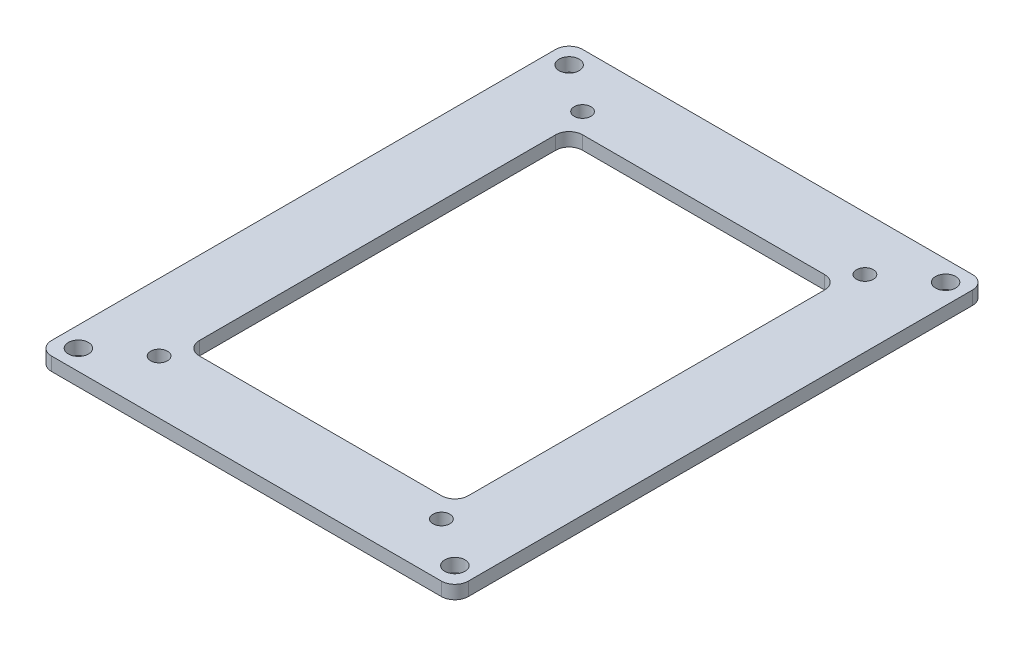
ISO-10303-21;
HEADER;
FILE_DESCRIPTION(('STEP AP214'),'2;1');
FILE_NAME('part.step','',(''),(''),'','','');
FILE_SCHEMA(('AUTOMOTIVE_DESIGN { 1 0 10303 214 1 1 1 1 }'));
ENDSEC;
DATA;
#1=APPLICATION_CONTEXT('core data for automotive mechanical design processes');
#2=APPLICATION_PROTOCOL_DEFINITION('international standard','automotive_design',2000,#1);
#3=PRODUCT_CONTEXT('',#1,'mechanical');
#4=PRODUCT('Part','Part','',(#3));
#5=PRODUCT_RELATED_PRODUCT_CATEGORY('part','',(#4));
#6=PRODUCT_DEFINITION_FORMATION('','',#4);
#7=PRODUCT_DEFINITION_CONTEXT('part definition',#1,'design');
#8=PRODUCT_DEFINITION('design','',#6,#7);
#9=PRODUCT_DEFINITION_SHAPE('','',#8);
#10=(LENGTH_UNIT() NAMED_UNIT(*) SI_UNIT(.MILLI.,.METRE.));
#11=(NAMED_UNIT(*) PLANE_ANGLE_UNIT() SI_UNIT($,.RADIAN.));
#12=(NAMED_UNIT(*) SI_UNIT($,.STERADIAN.) SOLID_ANGLE_UNIT());
#13=UNCERTAINTY_MEASURE_WITH_UNIT(LENGTH_MEASURE(1.E-05),#10,'distance_accuracy_value','');
#14=(GEOMETRIC_REPRESENTATION_CONTEXT(3) GLOBAL_UNCERTAINTY_ASSIGNED_CONTEXT((#13)) GLOBAL_UNIT_ASSIGNED_CONTEXT((#10,
#11,#12)) REPRESENTATION_CONTEXT('',''));
#15=CARTESIAN_POINT('',(0.,0.,0.));
#16=DIRECTION('',(0.,0.,1.));
#17=DIRECTION('',(1.,0.,0.));
#18=AXIS2_PLACEMENT_3D('',#15,#16,#17);
#19=CARTESIAN_POINT('',(0.,2.,0.));
#20=DIRECTION('',(0.,-1.,0.));
#21=DIRECTION('',(0.,0.,-1.));
#22=AXIS2_PLACEMENT_3D('',#19,#20,#21);
#23=PLANE('',#22);
#24=DIRECTION('',(-1.,0.,0.));
#25=VECTOR('',#24,1.);
#26=CARTESIAN_POINT('',(-20.,2.,-28.5));
#27=LINE('',#26,#25);
#28=CARTESIAN_POINT('',(18.,2.,-28.5));
#29=VERTEX_POINT('',#28);
#30=CARTESIAN_POINT('',(-18.,2.,-28.5));
#31=VERTEX_POINT('',#30);
#32=EDGE_CURVE('E257',#29,#31,#27,.T.);
#33=ORIENTED_EDGE('',*,*,#32,.F.);
#34=CARTESIAN_POINT('',(18.,2.,-26.5));
#35=DIRECTION('',(0.,-1.,0.));
#36=DIRECTION('',(0.,0.,-1.));
#37=AXIS2_PLACEMENT_3D('',#34,#35,#36);
#38=CIRCLE('',#37,2.);
#39=CARTESIAN_POINT('',(20.,2.,-26.5));
#40=VERTEX_POINT('',#39);
#41=EDGE_CURVE('E233',#29,#40,#38,.T.);
#42=ORIENTED_EDGE('',*,*,#41,.T.);
#43=DIRECTION('',(0.,0.,-1.));
#44=VECTOR('',#43,1.);
#45=CARTESIAN_POINT('',(20.,2.,28.5));
#46=LINE('',#45,#44);
#47=CARTESIAN_POINT('',(20.,2.,26.5));
#48=VERTEX_POINT('',#47);
#49=EDGE_CURVE('E279',#48,#40,#46,.T.);
#50=ORIENTED_EDGE('',*,*,#49,.F.);
#51=CARTESIAN_POINT('',(18.,2.,26.5));
#52=DIRECTION('',(0.,-1.,0.));
#53=DIRECTION('',(0.,0.,-1.));
#54=AXIS2_PLACEMENT_3D('',#51,#52,#53);
#55=CIRCLE('',#54,2.);
#56=CARTESIAN_POINT('',(18.,2.,28.5));
#57=VERTEX_POINT('',#56);
#58=EDGE_CURVE('E237',#48,#57,#55,.T.);
#59=ORIENTED_EDGE('',*,*,#58,.T.);
#60=DIRECTION('',(1.,0.,0.));
#61=VECTOR('',#60,1.);
#62=CARTESIAN_POINT('',(-20.,2.,28.5));
#63=LINE('',#62,#61);
#64=CARTESIAN_POINT('',(-18.,2.,28.5));
#65=VERTEX_POINT('',#64);
#66=EDGE_CURVE('E248',#65,#57,#63,.T.);
#67=ORIENTED_EDGE('',*,*,#66,.F.);
#68=CARTESIAN_POINT('',(-18.,2.,26.5));
#69=DIRECTION('',(0.,-1.,0.));
#70=DIRECTION('',(0.,0.,-1.));
#71=AXIS2_PLACEMENT_3D('',#68,#69,#70);
#72=CIRCLE('',#71,2.);
#73=CARTESIAN_POINT('',(-20.,2.,26.5));
#74=VERTEX_POINT('',#73);
#75=EDGE_CURVE('E43',#65,#74,#72,.T.);
#76=ORIENTED_EDGE('',*,*,#75,.T.);
#77=DIRECTION('',(0.,0.,1.));
#78=VECTOR('',#77,1.);
#79=CARTESIAN_POINT('',(-20.,2.,28.5));
#80=LINE('',#79,#78);
#81=CARTESIAN_POINT('',(-20.,2.,-26.5));
#82=VERTEX_POINT('',#81);
#83=EDGE_CURVE('E246',#82,#74,#80,.T.);
#84=ORIENTED_EDGE('',*,*,#83,.F.);
#85=CARTESIAN_POINT('',(-18.,2.,-26.5));
#86=DIRECTION('',(0.,-1.,0.));
#87=DIRECTION('',(0.,0.,-1.));
#88=AXIS2_PLACEMENT_3D('',#85,#86,#87);
#89=CIRCLE('',#88,2.);
#90=EDGE_CURVE('E229',#82,#31,#89,.T.);
#91=ORIENTED_EDGE('',*,*,#90,.T.);
#92=EDGE_LOOP('',(#33,#42,#50,#59,#67,#76,#84,#91));
#93=FACE_BOUND('',#92,.T.);
#94=CARTESIAN_POINT('',(28.,2.,36.5));
#95=DIRECTION('',(0.,1.,0.));
#96=DIRECTION('',(0.,0.,1.));
#97=AXIS2_PLACEMENT_3D('',#94,#95,#96);
#98=CIRCLE('',#97,1.49858919696237);
#99=CARTESIAN_POINT('',(28.,2.,37.9985891969624));
#100=VERTEX_POINT('',#99);
#101=EDGE_CURVE('E270',#100,#100,#98,.T.);
#102=ORIENTED_EDGE('',*,*,#101,.F.);
#103=EDGE_LOOP('',(#102));
#104=FACE_BOUND('',#103,.T.);
#105=CARTESIAN_POINT('',(-28.,2.,36.5));
#106=DIRECTION('',(0.,1.,0.));
#107=DIRECTION('',(0.,0.,1.));
#108=AXIS2_PLACEMENT_3D('',#105,#106,#107);
#109=CIRCLE('',#108,1.49858919696237);
#110=CARTESIAN_POINT('',(-28.,2.,37.9985891969624));
#111=VERTEX_POINT('',#110);
#112=EDGE_CURVE('E296',#111,#111,#109,.T.);
#113=ORIENTED_EDGE('',*,*,#112,.F.);
#114=EDGE_LOOP('',(#113));
#115=FACE_BOUND('',#114,.T.);
#116=CARTESIAN_POINT('',(-28.,2.,-36.5));
#117=DIRECTION('',(0.,1.,0.));
#118=DIRECTION('',(0.,0.,1.));
#119=AXIS2_PLACEMENT_3D('',#116,#117,#118);
#120=CIRCLE('',#119,1.49858919696237);
#121=CARTESIAN_POINT('',(-28.,2.,-35.0014108030376));
#122=VERTEX_POINT('',#121);
#123=EDGE_CURVE('E290',#122,#122,#120,.T.);
#124=ORIENTED_EDGE('',*,*,#123,.F.);
#125=EDGE_LOOP('',(#124));
#126=FACE_BOUND('',#125,.T.);
#127=CARTESIAN_POINT('',(28.,2.,-36.5));
#128=DIRECTION('',(0.,1.,0.));
#129=DIRECTION('',(0.,0.,1.));
#130=AXIS2_PLACEMENT_3D('',#127,#128,#129);
#131=CIRCLE('',#130,1.49858919696237);
#132=CARTESIAN_POINT('',(28.,2.,-35.0014108030376));
#133=VERTEX_POINT('',#132);
#134=EDGE_CURVE('E289',#133,#133,#131,.T.);
#135=ORIENTED_EDGE('',*,*,#134,.F.);
#136=EDGE_LOOP('',(#135));
#137=FACE_BOUND('',#136,.T.);
#138=DIRECTION('',(0.,0.,1.));
#139=VECTOR('',#138,1.);
#140=CARTESIAN_POINT('',(-31.,2.,39.5));
#141=LINE('',#140,#139);
#142=CARTESIAN_POINT('',(-31.,2.,-37.5));
#143=VERTEX_POINT('',#142);
#144=CARTESIAN_POINT('',(-31.,2.,37.5));
#145=VERTEX_POINT('',#144);
#146=EDGE_CURVE('E332',#143,#145,#141,.T.);
#147=ORIENTED_EDGE('',*,*,#146,.T.);
#148=CARTESIAN_POINT('',(-29.,2.,37.5));
#149=DIRECTION('',(0.,-1.,0.));
#150=DIRECTION('',(0.,0.,-1.));
#151=AXIS2_PLACEMENT_3D('',#148,#149,#150);
#152=CIRCLE('',#151,2.);
#153=CARTESIAN_POINT('',(-29.,2.,39.5));
#154=VERTEX_POINT('',#153);
#155=EDGE_CURVE('E198',#145,#154,#152,.F.);
#156=ORIENTED_EDGE('',*,*,#155,.T.);
#157=DIRECTION('',(1.,0.,0.));
#158=VECTOR('',#157,1.);
#159=CARTESIAN_POINT('',(-31.,2.,39.5));
#160=LINE('',#159,#158);
#161=CARTESIAN_POINT('',(29.,2.,39.5));
#162=VERTEX_POINT('',#161);
#163=EDGE_CURVE('E169',#154,#162,#160,.T.);
#164=ORIENTED_EDGE('',*,*,#163,.T.);
#165=CARTESIAN_POINT('',(29.,2.,37.5));
#166=DIRECTION('',(0.,-1.,0.));
#167=DIRECTION('',(0.,0.,-1.));
#168=AXIS2_PLACEMENT_3D('',#165,#166,#167);
#169=CIRCLE('',#168,2.);
#170=CARTESIAN_POINT('',(31.,2.,37.5));
#171=VERTEX_POINT('',#170);
#172=EDGE_CURVE('E193',#162,#171,#169,.F.);
#173=ORIENTED_EDGE('',*,*,#172,.T.);
#174=DIRECTION('',(0.,0.,-1.));
#175=VECTOR('',#174,1.);
#176=CARTESIAN_POINT('',(31.,2.,39.5));
#177=LINE('',#176,#175);
#178=CARTESIAN_POINT('',(31.,2.,-37.5));
#179=VERTEX_POINT('',#178);
#180=EDGE_CURVE('E176',#171,#179,#177,.T.);
#181=ORIENTED_EDGE('',*,*,#180,.T.);
#182=CARTESIAN_POINT('',(29.,2.,-37.5));
#183=DIRECTION('',(0.,-1.,0.));
#184=DIRECTION('',(0.,0.,-1.));
#185=AXIS2_PLACEMENT_3D('',#182,#183,#184);
#186=CIRCLE('',#185,2.);
#187=CARTESIAN_POINT('',(29.,2.,-39.5));
#188=VERTEX_POINT('',#187);
#189=EDGE_CURVE('E57',#179,#188,#186,.F.);
#190=ORIENTED_EDGE('',*,*,#189,.T.);
#191=DIRECTION('',(-1.,0.,0.));
#192=VECTOR('',#191,1.);
#193=CARTESIAN_POINT('',(-31.,2.,-39.5));
#194=LINE('',#193,#192);
#195=CARTESIAN_POINT('',(-29.,2.,-39.5));
#196=VERTEX_POINT('',#195);
#197=EDGE_CURVE('E179',#188,#196,#194,.T.);
#198=ORIENTED_EDGE('',*,*,#197,.T.);
#199=CARTESIAN_POINT('',(-29.,2.,-37.5));
#200=DIRECTION('',(0.,-1.,0.));
#201=DIRECTION('',(0.,0.,-1.));
#202=AXIS2_PLACEMENT_3D('',#199,#200,#201);
#203=CIRCLE('',#202,2.);
#204=EDGE_CURVE('E196',#196,#143,#203,.F.);
#205=ORIENTED_EDGE('',*,*,#204,.T.);
#206=EDGE_LOOP('',(#147,#156,#164,#173,#181,#190,#198,#205));
#207=FACE_BOUND('',#206,.T.);
#208=CARTESIAN_POINT('',(-21.,2.,-31.5));
#209=DIRECTION('',(0.,1.,0.));
#210=DIRECTION('',(0.,0.,1.));
#211=AXIS2_PLACEMENT_3D('',#208,#209,#210);
#212=CIRCLE('',#211,1.25);
#213=CARTESIAN_POINT('',(-21.,2.,-30.25));
#214=VERTEX_POINT('',#213);
#215=EDGE_CURVE('E325',#214,#214,#212,.T.);
#216=ORIENTED_EDGE('',*,*,#215,.F.);
#217=EDGE_LOOP('',(#216));
#218=FACE_BOUND('',#217,.T.);
#219=CARTESIAN_POINT('',(21.,2.,-31.5));
#220=DIRECTION('',(0.,1.,0.));
#221=DIRECTION('',(0.,0.,1.));
#222=AXIS2_PLACEMENT_3D('',#219,#220,#221);
#223=CIRCLE('',#222,1.25);
#224=CARTESIAN_POINT('',(21.,2.,-30.25));
#225=VERTEX_POINT('',#224);
#226=EDGE_CURVE('E319',#225,#225,#223,.T.);
#227=ORIENTED_EDGE('',*,*,#226,.F.);
#228=EDGE_LOOP('',(#227));
#229=FACE_BOUND('',#228,.T.);
#230=CARTESIAN_POINT('',(-21.,2.,31.5));
#231=DIRECTION('',(0.,1.,0.));
#232=DIRECTION('',(0.,0.,1.));
#233=AXIS2_PLACEMENT_3D('',#230,#231,#232);
#234=CIRCLE('',#233,1.25);
#235=CARTESIAN_POINT('',(-21.,2.,32.75));
#236=VERTEX_POINT('',#235);
#237=EDGE_CURVE('E313',#236,#236,#234,.T.);
#238=ORIENTED_EDGE('',*,*,#237,.F.);
#239=EDGE_LOOP('',(#238));
#240=FACE_BOUND('',#239,.T.);
#241=CARTESIAN_POINT('',(21.,2.,31.5));
#242=DIRECTION('',(0.,1.,0.));
#243=DIRECTION('',(0.,0.,1.));
#244=AXIS2_PLACEMENT_3D('',#241,#242,#243);
#245=CIRCLE('',#244,1.25);
#246=CARTESIAN_POINT('',(21.,2.,32.75));
#247=VERTEX_POINT('',#246);
#248=EDGE_CURVE('E307',#247,#247,#245,.T.);
#249=ORIENTED_EDGE('',*,*,#248,.F.);
#250=EDGE_LOOP('',(#249));
#251=FACE_BOUND('',#250,.T.);
#252=ADVANCED_FACE('F35',(#93,#104,#115,#126,#137,#207,#218,#229,#240,#251),#23,.F.);
#253=CARTESIAN_POINT('',(0.,0.,0.));
#254=DIRECTION('',(0.,-1.,0.));
#255=DIRECTION('',(0.,0.,-1.));
#256=AXIS2_PLACEMENT_3D('',#253,#254,#255);
#257=PLANE('',#256);
#258=DIRECTION('',(1.,0.,0.));
#259=VECTOR('',#258,1.);
#260=CARTESIAN_POINT('',(-20.,0.,28.5));
#261=LINE('',#260,#259);
#262=CARTESIAN_POINT('',(-18.,0.,28.5));
#263=VERTEX_POINT('',#262);
#264=CARTESIAN_POINT('',(18.,0.,28.5));
#265=VERTEX_POINT('',#264);
#266=EDGE_CURVE('E264',#263,#265,#261,.T.);
#267=ORIENTED_EDGE('',*,*,#266,.T.);
#268=CARTESIAN_POINT('',(18.,0.,26.5));
#269=DIRECTION('',(0.,-1.,0.));
#270=DIRECTION('',(0.,0.,-1.));
#271=AXIS2_PLACEMENT_3D('',#268,#269,#270);
#272=CIRCLE('',#271,2.);
#273=CARTESIAN_POINT('',(20.,0.,26.5));
#274=VERTEX_POINT('',#273);
#275=EDGE_CURVE('E239',#265,#274,#272,.F.);
#276=ORIENTED_EDGE('',*,*,#275,.T.);
#277=DIRECTION('',(0.,0.,-1.));
#278=VECTOR('',#277,1.);
#279=CARTESIAN_POINT('',(20.,0.,28.5));
#280=LINE('',#279,#278);
#281=CARTESIAN_POINT('',(20.,0.,-26.5));
#282=VERTEX_POINT('',#281);
#283=EDGE_CURVE('E285',#274,#282,#280,.T.);
#284=ORIENTED_EDGE('',*,*,#283,.T.);
#285=CARTESIAN_POINT('',(18.,0.,-26.5));
#286=DIRECTION('',(0.,-1.,0.));
#287=DIRECTION('',(0.,0.,-1.));
#288=AXIS2_PLACEMENT_3D('',#285,#286,#287);
#289=CIRCLE('',#288,2.);
#290=CARTESIAN_POINT('',(18.,0.,-28.5));
#291=VERTEX_POINT('',#290);
#292=EDGE_CURVE('E235',#282,#291,#289,.F.);
#293=ORIENTED_EDGE('',*,*,#292,.T.);
#294=DIRECTION('',(-1.,0.,0.));
#295=VECTOR('',#294,1.);
#296=CARTESIAN_POINT('',(-20.,0.,-28.5));
#297=LINE('',#296,#295);
#298=CARTESIAN_POINT('',(-18.,0.,-28.5));
#299=VERTEX_POINT('',#298);
#300=EDGE_CURVE('E275',#291,#299,#297,.T.);
#301=ORIENTED_EDGE('',*,*,#300,.T.);
#302=CARTESIAN_POINT('',(-18.,0.,-26.5));
#303=DIRECTION('',(0.,-1.,0.));
#304=DIRECTION('',(0.,0.,-1.));
#305=AXIS2_PLACEMENT_3D('',#302,#303,#304);
#306=CIRCLE('',#305,2.);
#307=CARTESIAN_POINT('',(-20.,0.,-26.5));
#308=VERTEX_POINT('',#307);
#309=EDGE_CURVE('E231',#299,#308,#306,.F.);
#310=ORIENTED_EDGE('',*,*,#309,.T.);
#311=DIRECTION('',(0.,0.,1.));
#312=VECTOR('',#311,1.);
#313=CARTESIAN_POINT('',(-20.,0.,28.5));
#314=LINE('',#313,#312);
#315=CARTESIAN_POINT('',(-20.,0.,26.5));
#316=VERTEX_POINT('',#315);
#317=EDGE_CURVE('E266',#308,#316,#314,.T.);
#318=ORIENTED_EDGE('',*,*,#317,.T.);
#319=CARTESIAN_POINT('',(-18.,0.,26.5));
#320=DIRECTION('',(0.,-1.,0.));
#321=DIRECTION('',(0.,0.,-1.));
#322=AXIS2_PLACEMENT_3D('',#319,#320,#321);
#323=CIRCLE('',#322,2.);
#324=EDGE_CURVE('E11',#316,#263,#323,.F.);
#325=ORIENTED_EDGE('',*,*,#324,.T.);
#326=EDGE_LOOP('',(#267,#276,#284,#293,#301,#310,#318,#325));
#327=FACE_BOUND('',#326,.T.);
#328=CARTESIAN_POINT('',(28.,0.,36.5));
#329=DIRECTION('',(0.,1.,0.));
#330=DIRECTION('',(0.,0.,1.));
#331=AXIS2_PLACEMENT_3D('',#328,#329,#330);
#332=CIRCLE('',#331,1.49858919696237);
#333=CARTESIAN_POINT('',(28.,0.,37.9985891969624));
#334=VERTEX_POINT('',#333);
#335=EDGE_CURVE('E273',#334,#334,#332,.T.);
#336=ORIENTED_EDGE('',*,*,#335,.T.);
#337=EDGE_LOOP('',(#336));
#338=FACE_BOUND('',#337,.T.);
#339=CARTESIAN_POINT('',(-28.,0.,36.5));
#340=DIRECTION('',(0.,1.,0.));
#341=DIRECTION('',(0.,0.,1.));
#342=AXIS2_PLACEMENT_3D('',#339,#340,#341);
#343=CIRCLE('',#342,1.49858919696237);
#344=CARTESIAN_POINT('',(-28.,0.,37.9985891969624));
#345=VERTEX_POINT('',#344);
#346=EDGE_CURVE('E293',#345,#345,#343,.T.);
#347=ORIENTED_EDGE('',*,*,#346,.T.);
#348=EDGE_LOOP('',(#347));
#349=FACE_BOUND('',#348,.T.);
#350=CARTESIAN_POINT('',(-28.,0.,-36.5));
#351=DIRECTION('',(0.,1.,0.));
#352=DIRECTION('',(0.,0.,1.));
#353=AXIS2_PLACEMENT_3D('',#350,#351,#352);
#354=CIRCLE('',#353,1.49858919696237);
#355=CARTESIAN_POINT('',(-28.,0.,-35.0014108030376));
#356=VERTEX_POINT('',#355);
#357=EDGE_CURVE('E286',#356,#356,#354,.T.);
#358=ORIENTED_EDGE('',*,*,#357,.T.);
#359=EDGE_LOOP('',(#358));
#360=FACE_BOUND('',#359,.T.);
#361=CARTESIAN_POINT('',(28.,0.,-36.5));
#362=DIRECTION('',(0.,1.,0.));
#363=DIRECTION('',(0.,0.,1.));
#364=AXIS2_PLACEMENT_3D('',#361,#362,#363);
#365=CIRCLE('',#364,1.49858919696237);
#366=CARTESIAN_POINT('',(28.,0.,-35.0014108030376));
#367=VERTEX_POINT('',#366);
#368=EDGE_CURVE('E301',#367,#367,#365,.T.);
#369=ORIENTED_EDGE('',*,*,#368,.T.);
#370=EDGE_LOOP('',(#369));
#371=FACE_BOUND('',#370,.T.);
#372=CARTESIAN_POINT('',(-21.,0.,31.5));
#373=DIRECTION('',(0.,1.,0.));
#374=DIRECTION('',(0.,0.,1.));
#375=AXIS2_PLACEMENT_3D('',#372,#373,#374);
#376=CIRCLE('',#375,1.25);
#377=CARTESIAN_POINT('',(-21.,0.,32.75));
#378=VERTEX_POINT('',#377);
#379=EDGE_CURVE('E310',#378,#378,#376,.T.);
#380=ORIENTED_EDGE('',*,*,#379,.T.);
#381=EDGE_LOOP('',(#380));
#382=FACE_BOUND('',#381,.T.);
#383=CARTESIAN_POINT('',(-21.,0.,-31.5));
#384=DIRECTION('',(0.,1.,0.));
#385=DIRECTION('',(0.,0.,1.));
#386=AXIS2_PLACEMENT_3D('',#383,#384,#385);
#387=CIRCLE('',#386,1.25);
#388=CARTESIAN_POINT('',(-21.,0.,-30.25));
#389=VERTEX_POINT('',#388);
#390=EDGE_CURVE('E322',#389,#389,#387,.T.);
#391=ORIENTED_EDGE('',*,*,#390,.T.);
#392=EDGE_LOOP('',(#391));
#393=FACE_BOUND('',#392,.T.);
#394=DIRECTION('',(1.,0.,0.));
#395=VECTOR('',#394,1.);
#396=CARTESIAN_POINT('',(-31.,0.,39.5));
#397=LINE('',#396,#395);
#398=CARTESIAN_POINT('',(-29.,0.,39.5));
#399=VERTEX_POINT('',#398);
#400=CARTESIAN_POINT('',(29.,0.,39.5));
#401=VERTEX_POINT('',#400);
#402=EDGE_CURVE('E166',#399,#401,#397,.T.);
#403=ORIENTED_EDGE('',*,*,#402,.F.);
#404=CARTESIAN_POINT('',(-29.,0.,37.5));
#405=DIRECTION('',(0.,-1.,0.));
#406=DIRECTION('',(0.,0.,-1.));
#407=AXIS2_PLACEMENT_3D('',#404,#405,#406);
#408=CIRCLE('',#407,2.);
#409=CARTESIAN_POINT('',(-31.,0.,37.5));
#410=VERTEX_POINT('',#409);
#411=EDGE_CURVE('E149',#399,#410,#408,.T.);
#412=ORIENTED_EDGE('',*,*,#411,.T.);
#413=DIRECTION('',(0.,0.,1.));
#414=VECTOR('',#413,1.);
#415=CARTESIAN_POINT('',(-31.,0.,39.5));
#416=LINE('',#415,#414);
#417=CARTESIAN_POINT('',(-31.,0.,-37.5));
#418=VERTEX_POINT('',#417);
#419=EDGE_CURVE('E177',#418,#410,#416,.T.);
#420=ORIENTED_EDGE('',*,*,#419,.F.);
#421=CARTESIAN_POINT('',(-29.,0.,-37.5));
#422=DIRECTION('',(0.,-1.,0.));
#423=DIRECTION('',(0.,0.,-1.));
#424=AXIS2_PLACEMENT_3D('',#421,#422,#423);
#425=CIRCLE('',#424,2.);
#426=CARTESIAN_POINT('',(-29.,0.,-39.5));
#427=VERTEX_POINT('',#426);
#428=EDGE_CURVE('E160',#418,#427,#425,.T.);
#429=ORIENTED_EDGE('',*,*,#428,.T.);
#430=DIRECTION('',(-1.,0.,0.));
#431=VECTOR('',#430,1.);
#432=CARTESIAN_POINT('',(-31.,0.,-39.5));
#433=LINE('',#432,#431);
#434=CARTESIAN_POINT('',(29.,0.,-39.5));
#435=VERTEX_POINT('',#434);
#436=EDGE_CURVE('E181',#435,#427,#433,.T.);
#437=ORIENTED_EDGE('',*,*,#436,.F.);
#438=CARTESIAN_POINT('',(29.,0.,-37.5));
#439=DIRECTION('',(0.,-1.,0.));
#440=DIRECTION('',(0.,0.,-1.));
#441=AXIS2_PLACEMENT_3D('',#438,#439,#440);
#442=CIRCLE('',#441,2.);
#443=CARTESIAN_POINT('',(31.,0.,-37.5));
#444=VERTEX_POINT('',#443);
#445=EDGE_CURVE('E187',#435,#444,#442,.T.);
#446=ORIENTED_EDGE('',*,*,#445,.T.);
#447=DIRECTION('',(0.,0.,-1.));
#448=VECTOR('',#447,1.);
#449=CARTESIAN_POINT('',(31.,0.,39.5));
#450=LINE('',#449,#448);
#451=CARTESIAN_POINT('',(31.,0.,37.5));
#452=VERTEX_POINT('',#451);
#453=EDGE_CURVE('E328',#452,#444,#450,.T.);
#454=ORIENTED_EDGE('',*,*,#453,.F.);
#455=CARTESIAN_POINT('',(29.,0.,37.5));
#456=DIRECTION('',(0.,-1.,0.));
#457=DIRECTION('',(0.,0.,-1.));
#458=AXIS2_PLACEMENT_3D('',#455,#456,#457);
#459=CIRCLE('',#458,2.);
#460=EDGE_CURVE('E170',#452,#401,#459,.T.);
#461=ORIENTED_EDGE('',*,*,#460,.T.);
#462=EDGE_LOOP('',(#403,#412,#420,#429,#437,#446,#454,#461));
#463=FACE_BOUND('',#462,.T.);
#464=CARTESIAN_POINT('',(21.,0.,-31.5));
#465=DIRECTION('',(0.,1.,0.));
#466=DIRECTION('',(0.,0.,1.));
#467=AXIS2_PLACEMENT_3D('',#464,#465,#466);
#468=CIRCLE('',#467,1.25);
#469=CARTESIAN_POINT('',(21.,0.,-30.25));
#470=VERTEX_POINT('',#469);
#471=EDGE_CURVE('E316',#470,#470,#468,.T.);
#472=ORIENTED_EDGE('',*,*,#471,.T.);
#473=EDGE_LOOP('',(#472));
#474=FACE_BOUND('',#473,.T.);
#475=CARTESIAN_POINT('',(21.,0.,31.5));
#476=DIRECTION('',(0.,1.,0.));
#477=DIRECTION('',(0.,0.,1.));
#478=AXIS2_PLACEMENT_3D('',#475,#476,#477);
#479=CIRCLE('',#478,1.25);
#480=CARTESIAN_POINT('',(21.,0.,32.75));
#481=VERTEX_POINT('',#480);
#482=EDGE_CURVE('E304',#481,#481,#479,.T.);
#483=ORIENTED_EDGE('',*,*,#482,.T.);
#484=EDGE_LOOP('',(#483));
#485=FACE_BOUND('',#484,.T.);
#486=ADVANCED_FACE('F173',(#327,#338,#349,#360,#371,#382,#393,#463,#474,#485),#257,.T.);
#487=CARTESIAN_POINT('',(31.,2.,39.5));
#488=DIRECTION('',(-1.,0.,0.));
#489=DIRECTION('',(0.,0.,1.));
#490=AXIS2_PLACEMENT_3D('',#487,#488,#489);
#491=PLANE('',#490);
#492=ORIENTED_EDGE('',*,*,#453,.T.);
#493=DIRECTION('',(0.,-1.,0.));
#494=VECTOR('',#493,1.);
#495=CARTESIAN_POINT('',(31.,2.,-37.5));
#496=LINE('',#495,#494);
#497=EDGE_CURVE('E207',#444,#179,#496,.F.);
#498=ORIENTED_EDGE('',*,*,#497,.T.);
#499=ORIENTED_EDGE('',*,*,#180,.F.);
#500=DIRECTION('',(0.,-1.,0.));
#501=VECTOR('',#500,1.);
#502=CARTESIAN_POINT('',(31.,2.,37.5));
#503=LINE('',#502,#501);
#504=EDGE_CURVE('E204',#171,#452,#503,.T.);
#505=ORIENTED_EDGE('',*,*,#504,.T.);
#506=EDGE_LOOP('',(#492,#498,#499,#505));
#507=FACE_BOUND('',#506,.T.);
#508=ADVANCED_FACE('F356',(#507),#491,.F.);
#509=CARTESIAN_POINT('',(-31.,2.,-39.5));
#510=DIRECTION('',(0.,0.,1.));
#511=DIRECTION('',(1.,0.,0.));
#512=AXIS2_PLACEMENT_3D('',#509,#510,#511);
#513=PLANE('',#512);
#514=ORIENTED_EDGE('',*,*,#436,.T.);
#515=DIRECTION('',(0.,-1.,0.));
#516=VECTOR('',#515,1.);
#517=CARTESIAN_POINT('',(-29.,2.,-39.5));
#518=LINE('',#517,#516);
#519=EDGE_CURVE('E50',#427,#196,#518,.F.);
#520=ORIENTED_EDGE('',*,*,#519,.T.);
#521=ORIENTED_EDGE('',*,*,#197,.F.);
#522=DIRECTION('',(0.,-1.,0.));
#523=VECTOR('',#522,1.);
#524=CARTESIAN_POINT('',(29.,2.,-39.5));
#525=LINE('',#524,#523);
#526=EDGE_CURVE('E200',#188,#435,#525,.T.);
#527=ORIENTED_EDGE('',*,*,#526,.T.);
#528=EDGE_LOOP('',(#514,#520,#521,#527));
#529=FACE_BOUND('',#528,.T.);
#530=ADVANCED_FACE('F338',(#529),#513,.F.);
#531=CARTESIAN_POINT('',(-31.,2.,39.5));
#532=DIRECTION('',(1.,0.,0.));
#533=DIRECTION('',(0.,0.,-1.));
#534=AXIS2_PLACEMENT_3D('',#531,#532,#533);
#535=PLANE('',#534);
#536=ORIENTED_EDGE('',*,*,#419,.T.);
#537=DIRECTION('',(0.,-1.,0.));
#538=VECTOR('',#537,1.);
#539=CARTESIAN_POINT('',(-31.,2.,37.5));
#540=LINE('',#539,#538);
#541=EDGE_CURVE('E154',#410,#145,#540,.F.);
#542=ORIENTED_EDGE('',*,*,#541,.T.);
#543=ORIENTED_EDGE('',*,*,#146,.F.);
#544=DIRECTION('',(0.,-1.,0.));
#545=VECTOR('',#544,1.);
#546=CARTESIAN_POINT('',(-31.,2.,-37.5));
#547=LINE('',#546,#545);
#548=EDGE_CURVE('E159',#143,#418,#547,.T.);
#549=ORIENTED_EDGE('',*,*,#548,.T.);
#550=EDGE_LOOP('',(#536,#542,#543,#549));
#551=FACE_BOUND('',#550,.T.);
#552=ADVANCED_FACE('F347',(#551),#535,.F.);
#553=CARTESIAN_POINT('',(-31.,2.,39.5));
#554=DIRECTION('',(0.,0.,-1.));
#555=DIRECTION('',(-1.,0.,0.));
#556=AXIS2_PLACEMENT_3D('',#553,#554,#555);
#557=PLANE('',#556);
#558=ORIENTED_EDGE('',*,*,#163,.F.);
#559=DIRECTION('',(0.,-1.,0.));
#560=VECTOR('',#559,1.);
#561=CARTESIAN_POINT('',(-29.,2.,39.5));
#562=LINE('',#561,#560);
#563=EDGE_CURVE('E153',#154,#399,#562,.T.);
#564=ORIENTED_EDGE('',*,*,#563,.T.);
#565=ORIENTED_EDGE('',*,*,#402,.T.);
#566=DIRECTION('',(0.,-1.,0.));
#567=VECTOR('',#566,1.);
#568=CARTESIAN_POINT('',(29.,2.,39.5));
#569=LINE('',#568,#567);
#570=EDGE_CURVE('E171',#401,#162,#569,.F.);
#571=ORIENTED_EDGE('',*,*,#570,.T.);
#572=EDGE_LOOP('',(#558,#564,#565,#571));
#573=FACE_BOUND('',#572,.T.);
#574=ADVANCED_FACE('F165',(#573),#557,.F.);
#575=CARTESIAN_POINT('',(-21.,2.,-31.5));
#576=DIRECTION('',(0.,-1.,0.));
#577=DIRECTION('',(0.,0.,-1.));
#578=AXIS2_PLACEMENT_3D('',#575,#576,#577);
#579=CYLINDRICAL_SURFACE('',#578,1.25);
#580=ORIENTED_EDGE('',*,*,#215,.T.);
#581=EDGE_LOOP('',(#580));
#582=FACE_BOUND('',#581,.T.);
#583=ORIENTED_EDGE('',*,*,#390,.F.);
#584=EDGE_LOOP('',(#583));
#585=FACE_BOUND('',#584,.T.);
#586=ADVANCED_FACE('F354',(#582,#585),#579,.F.);
#587=CARTESIAN_POINT('',(21.,2.,-31.5));
#588=DIRECTION('',(0.,-1.,0.));
#589=DIRECTION('',(0.,0.,-1.));
#590=AXIS2_PLACEMENT_3D('',#587,#588,#589);
#591=CYLINDRICAL_SURFACE('',#590,1.25);
#592=ORIENTED_EDGE('',*,*,#226,.T.);
#593=EDGE_LOOP('',(#592));
#594=FACE_BOUND('',#593,.T.);
#595=ORIENTED_EDGE('',*,*,#471,.F.);
#596=EDGE_LOOP('',(#595));
#597=FACE_BOUND('',#596,.T.);
#598=ADVANCED_FACE('F367',(#594,#597),#591,.F.);
#599=CARTESIAN_POINT('',(-21.,2.,31.5));
#600=DIRECTION('',(0.,-1.,0.));
#601=DIRECTION('',(0.,0.,-1.));
#602=AXIS2_PLACEMENT_3D('',#599,#600,#601);
#603=CYLINDRICAL_SURFACE('',#602,1.25);
#604=ORIENTED_EDGE('',*,*,#237,.T.);
#605=EDGE_LOOP('',(#604));
#606=FACE_BOUND('',#605,.T.);
#607=ORIENTED_EDGE('',*,*,#379,.F.);
#608=EDGE_LOOP('',(#607));
#609=FACE_BOUND('',#608,.T.);
#610=ADVANCED_FACE('F371',(#606,#609),#603,.F.);
#611=CARTESIAN_POINT('',(21.,2.,31.5));
#612=DIRECTION('',(0.,-1.,0.));
#613=DIRECTION('',(0.,0.,-1.));
#614=AXIS2_PLACEMENT_3D('',#611,#612,#613);
#615=CYLINDRICAL_SURFACE('',#614,1.25);
#616=ORIENTED_EDGE('',*,*,#248,.T.);
#617=EDGE_LOOP('',(#616));
#618=FACE_BOUND('',#617,.T.);
#619=ORIENTED_EDGE('',*,*,#482,.F.);
#620=EDGE_LOOP('',(#619));
#621=FACE_BOUND('',#620,.T.);
#622=ADVANCED_FACE('F375',(#618,#621),#615,.F.);
#623=CARTESIAN_POINT('',(28.,0.,-36.5));
#624=DIRECTION('',(0.,1.,0.));
#625=DIRECTION('',(0.,0.,1.));
#626=AXIS2_PLACEMENT_3D('',#623,#624,#625);
#627=CYLINDRICAL_SURFACE('',#626,1.49858919696237);
#628=ORIENTED_EDGE('',*,*,#368,.F.);
#629=EDGE_LOOP('',(#628));
#630=FACE_BOUND('',#629,.T.);
#631=ORIENTED_EDGE('',*,*,#134,.T.);
#632=EDGE_LOOP('',(#631));
#633=FACE_BOUND('',#632,.T.);
#634=ADVANCED_FACE('F379',(#630,#633),#627,.F.);
#635=CARTESIAN_POINT('',(-28.,0.,-36.5));
#636=DIRECTION('',(0.,1.,0.));
#637=DIRECTION('',(0.,0.,1.));
#638=AXIS2_PLACEMENT_3D('',#635,#636,#637);
#639=CYLINDRICAL_SURFACE('',#638,1.49858919696237);
#640=ORIENTED_EDGE('',*,*,#357,.F.);
#641=EDGE_LOOP('',(#640));
#642=FACE_BOUND('',#641,.T.);
#643=ORIENTED_EDGE('',*,*,#123,.T.);
#644=EDGE_LOOP('',(#643));
#645=FACE_BOUND('',#644,.T.);
#646=ADVANCED_FACE('F383',(#642,#645),#639,.F.);
#647=CARTESIAN_POINT('',(-28.,0.,36.5));
#648=DIRECTION('',(0.,1.,0.));
#649=DIRECTION('',(0.,0.,1.));
#650=AXIS2_PLACEMENT_3D('',#647,#648,#649);
#651=CYLINDRICAL_SURFACE('',#650,1.49858919696237);
#652=ORIENTED_EDGE('',*,*,#346,.F.);
#653=EDGE_LOOP('',(#652));
#654=FACE_BOUND('',#653,.T.);
#655=ORIENTED_EDGE('',*,*,#112,.T.);
#656=EDGE_LOOP('',(#655));
#657=FACE_BOUND('',#656,.T.);
#658=ADVANCED_FACE('F389',(#654,#657),#651,.F.);
#659=CARTESIAN_POINT('',(28.,0.,36.5));
#660=DIRECTION('',(0.,1.,0.));
#661=DIRECTION('',(0.,0.,1.));
#662=AXIS2_PLACEMENT_3D('',#659,#660,#661);
#663=CYLINDRICAL_SURFACE('',#662,1.49858919696237);
#664=ORIENTED_EDGE('',*,*,#335,.F.);
#665=EDGE_LOOP('',(#664));
#666=FACE_BOUND('',#665,.T.);
#667=ORIENTED_EDGE('',*,*,#101,.T.);
#668=EDGE_LOOP('',(#667));
#669=FACE_BOUND('',#668,.T.);
#670=ADVANCED_FACE('F385',(#666,#669),#663,.F.);
#671=CARTESIAN_POINT('',(20.,0.,28.5));
#672=DIRECTION('',(1.,0.,0.));
#673=DIRECTION('',(0.,0.,-1.));
#674=AXIS2_PLACEMENT_3D('',#671,#672,#673);
#675=PLANE('',#674);
#676=ORIENTED_EDGE('',*,*,#49,.T.);
#677=DIRECTION('',(0.,1.,0.));
#678=VECTOR('',#677,1.);
#679=CARTESIAN_POINT('',(20.,0.,-26.5));
#680=LINE('',#679,#678);
#681=EDGE_CURVE('E222',#40,#282,#680,.F.);
#682=ORIENTED_EDGE('',*,*,#681,.T.);
#683=ORIENTED_EDGE('',*,*,#283,.F.);
#684=DIRECTION('',(0.,1.,0.));
#685=VECTOR('',#684,1.);
#686=CARTESIAN_POINT('',(20.,2.,26.5));
#687=LINE('',#686,#685);
#688=EDGE_CURVE('E219',#274,#48,#687,.T.);
#689=ORIENTED_EDGE('',*,*,#688,.T.);
#690=EDGE_LOOP('',(#676,#682,#683,#689));
#691=FACE_BOUND('',#690,.T.);
#692=ADVANCED_FACE('F388',(#691),#675,.F.);
#693=CARTESIAN_POINT('',(-20.,0.,28.5));
#694=DIRECTION('',(0.,0.,1.));
#695=DIRECTION('',(1.,0.,0.));
#696=AXIS2_PLACEMENT_3D('',#693,#694,#695);
#697=PLANE('',#696);
#698=ORIENTED_EDGE('',*,*,#66,.T.);
#699=DIRECTION('',(0.,1.,0.));
#700=VECTOR('',#699,1.);
#701=CARTESIAN_POINT('',(18.,0.,28.5));
#702=LINE('',#701,#700);
#703=EDGE_CURVE('E227',#57,#265,#702,.F.);
#704=ORIENTED_EDGE('',*,*,#703,.T.);
#705=ORIENTED_EDGE('',*,*,#266,.F.);
#706=DIRECTION('',(0.,1.,0.));
#707=VECTOR('',#706,1.);
#708=CARTESIAN_POINT('',(-18.,2.,28.5));
#709=LINE('',#708,#707);
#710=EDGE_CURVE('E224',#263,#65,#709,.T.);
#711=ORIENTED_EDGE('',*,*,#710,.T.);
#712=EDGE_LOOP('',(#698,#704,#705,#711));
#713=FACE_BOUND('',#712,.T.);
#714=ADVANCED_FACE('F268',(#713),#697,.F.);
#715=CARTESIAN_POINT('',(-20.,0.,28.5));
#716=DIRECTION('',(-1.,0.,0.));
#717=DIRECTION('',(0.,0.,1.));
#718=AXIS2_PLACEMENT_3D('',#715,#716,#717);
#719=PLANE('',#718);
#720=ORIENTED_EDGE('',*,*,#317,.F.);
#721=DIRECTION('',(0.,1.,0.));
#722=VECTOR('',#721,1.);
#723=CARTESIAN_POINT('',(-20.,2.,-26.5));
#724=LINE('',#723,#722);
#725=EDGE_CURVE('E211',#308,#82,#724,.T.);
#726=ORIENTED_EDGE('',*,*,#725,.T.);
#727=ORIENTED_EDGE('',*,*,#83,.T.);
#728=DIRECTION('',(0.,1.,0.));
#729=VECTOR('',#728,1.);
#730=CARTESIAN_POINT('',(-20.,0.,26.5));
#731=LINE('',#730,#729);
#732=EDGE_CURVE('E209',#74,#316,#731,.F.);
#733=ORIENTED_EDGE('',*,*,#732,.T.);
#734=EDGE_LOOP('',(#720,#726,#727,#733));
#735=FACE_BOUND('',#734,.T.);
#736=ADVANCED_FACE('F254',(#735),#719,.F.);
#737=CARTESIAN_POINT('',(-20.,0.,-28.5));
#738=DIRECTION('',(0.,0.,-1.));
#739=DIRECTION('',(-1.,0.,0.));
#740=AXIS2_PLACEMENT_3D('',#737,#738,#739);
#741=PLANE('',#740);
#742=ORIENTED_EDGE('',*,*,#32,.T.);
#743=DIRECTION('',(0.,1.,0.));
#744=VECTOR('',#743,1.);
#745=CARTESIAN_POINT('',(-18.,0.,-28.5));
#746=LINE('',#745,#744);
#747=EDGE_CURVE('E217',#31,#299,#746,.F.);
#748=ORIENTED_EDGE('',*,*,#747,.T.);
#749=ORIENTED_EDGE('',*,*,#300,.F.);
#750=DIRECTION('',(0.,1.,0.));
#751=VECTOR('',#750,1.);
#752=CARTESIAN_POINT('',(18.,2.,-28.5));
#753=LINE('',#752,#751);
#754=EDGE_CURVE('E214',#291,#29,#753,.T.);
#755=ORIENTED_EDGE('',*,*,#754,.T.);
#756=EDGE_LOOP('',(#742,#748,#749,#755));
#757=FACE_BOUND('',#756,.T.);
#758=ADVANCED_FACE('F400',(#757),#741,.F.);
#759=CARTESIAN_POINT('',(-29.,2.,37.5));
#760=DIRECTION('',(0.,-1.,0.));
#761=DIRECTION('',(0.,0.,-1.));
#762=AXIS2_PLACEMENT_3D('',#759,#760,#761);
#763=CYLINDRICAL_SURFACE('',#762,2.);
#764=ORIENTED_EDGE('',*,*,#155,.F.);
#765=ORIENTED_EDGE('',*,*,#541,.F.);
#766=ORIENTED_EDGE('',*,*,#411,.F.);
#767=ORIENTED_EDGE('',*,*,#563,.F.);
#768=EDGE_LOOP('',(#764,#765,#766,#767));
#769=FACE_BOUND('',#768,.T.);
#770=ADVANCED_FACE('F152',(#769),#763,.T.);
#771=CARTESIAN_POINT('',(-29.,2.,-37.5));
#772=DIRECTION('',(0.,-1.,0.));
#773=DIRECTION('',(0.,0.,-1.));
#774=AXIS2_PLACEMENT_3D('',#771,#772,#773);
#775=CYLINDRICAL_SURFACE('',#774,2.);
#776=ORIENTED_EDGE('',*,*,#204,.F.);
#777=ORIENTED_EDGE('',*,*,#519,.F.);
#778=ORIENTED_EDGE('',*,*,#428,.F.);
#779=ORIENTED_EDGE('',*,*,#548,.F.);
#780=EDGE_LOOP('',(#776,#777,#778,#779));
#781=FACE_BOUND('',#780,.T.);
#782=ADVANCED_FACE('F342',(#781),#775,.T.);
#783=CARTESIAN_POINT('',(29.,2.,-37.5));
#784=DIRECTION('',(0.,-1.,0.));
#785=DIRECTION('',(0.,0.,-1.));
#786=AXIS2_PLACEMENT_3D('',#783,#784,#785);
#787=CYLINDRICAL_SURFACE('',#786,2.);
#788=ORIENTED_EDGE('',*,*,#189,.F.);
#789=ORIENTED_EDGE('',*,*,#497,.F.);
#790=ORIENTED_EDGE('',*,*,#445,.F.);
#791=ORIENTED_EDGE('',*,*,#526,.F.);
#792=EDGE_LOOP('',(#788,#789,#790,#791));
#793=FACE_BOUND('',#792,.T.);
#794=ADVANCED_FACE('F431',(#793),#787,.T.);
#795=CARTESIAN_POINT('',(29.,2.,37.5));
#796=DIRECTION('',(0.,-1.,0.));
#797=DIRECTION('',(0.,0.,-1.));
#798=AXIS2_PLACEMENT_3D('',#795,#796,#797);
#799=CYLINDRICAL_SURFACE('',#798,2.);
#800=ORIENTED_EDGE('',*,*,#172,.F.);
#801=ORIENTED_EDGE('',*,*,#570,.F.);
#802=ORIENTED_EDGE('',*,*,#460,.F.);
#803=ORIENTED_EDGE('',*,*,#504,.F.);
#804=EDGE_LOOP('',(#800,#801,#802,#803));
#805=FACE_BOUND('',#804,.T.);
#806=ADVANCED_FACE('F438',(#805),#799,.T.);
#807=CARTESIAN_POINT('',(-18.,0.,-26.5));
#808=DIRECTION('',(0.,-1.,0.));
#809=DIRECTION('',(0.,0.,-1.));
#810=AXIS2_PLACEMENT_3D('',#807,#808,#809);
#811=CYLINDRICAL_SURFACE('',#810,2.);
#812=ORIENTED_EDGE('',*,*,#309,.F.);
#813=ORIENTED_EDGE('',*,*,#747,.F.);
#814=ORIENTED_EDGE('',*,*,#90,.F.);
#815=ORIENTED_EDGE('',*,*,#725,.F.);
#816=EDGE_LOOP('',(#812,#813,#814,#815));
#817=FACE_BOUND('',#816,.T.);
#818=ADVANCED_FACE('F446',(#817),#811,.F.);
#819=CARTESIAN_POINT('',(18.,0.,-26.5));
#820=DIRECTION('',(0.,-1.,0.));
#821=DIRECTION('',(0.,0.,-1.));
#822=AXIS2_PLACEMENT_3D('',#819,#820,#821);
#823=CYLINDRICAL_SURFACE('',#822,2.);
#824=ORIENTED_EDGE('',*,*,#292,.F.);
#825=ORIENTED_EDGE('',*,*,#681,.F.);
#826=ORIENTED_EDGE('',*,*,#41,.F.);
#827=ORIENTED_EDGE('',*,*,#754,.F.);
#828=EDGE_LOOP('',(#824,#825,#826,#827));
#829=FACE_BOUND('',#828,.T.);
#830=ADVANCED_FACE('F454',(#829),#823,.F.);
#831=CARTESIAN_POINT('',(18.,0.,26.5));
#832=DIRECTION('',(0.,-1.,0.));
#833=DIRECTION('',(0.,0.,-1.));
#834=AXIS2_PLACEMENT_3D('',#831,#832,#833);
#835=CYLINDRICAL_SURFACE('',#834,2.);
#836=ORIENTED_EDGE('',*,*,#275,.F.);
#837=ORIENTED_EDGE('',*,*,#703,.F.);
#838=ORIENTED_EDGE('',*,*,#58,.F.);
#839=ORIENTED_EDGE('',*,*,#688,.F.);
#840=EDGE_LOOP('',(#836,#837,#838,#839));
#841=FACE_BOUND('',#840,.T.);
#842=ADVANCED_FACE('F462',(#841),#835,.F.);
#843=CARTESIAN_POINT('',(-18.,0.,26.5));
#844=DIRECTION('',(0.,-1.,0.));
#845=DIRECTION('',(0.,0.,-1.));
#846=AXIS2_PLACEMENT_3D('',#843,#844,#845);
#847=CYLINDRICAL_SURFACE('',#846,2.);
#848=ORIENTED_EDGE('',*,*,#324,.F.);
#849=ORIENTED_EDGE('',*,*,#732,.F.);
#850=ORIENTED_EDGE('',*,*,#75,.F.);
#851=ORIENTED_EDGE('',*,*,#710,.F.);
#852=EDGE_LOOP('',(#848,#849,#850,#851));
#853=FACE_BOUND('',#852,.T.);
#854=ADVANCED_FACE('F37',(#853),#847,.F.);
#855=CLOSED_SHELL('',(#252,#486,#508,#530,#552,#574,#586,#598,#610,#622,#634,#646,#658,#670,
#692,#714,#736,#758,#770,#782,#794,#806,#818,#830,#842,#854));
#856=MANIFOLD_SOLID_BREP('B2',#855);
#857=ADVANCED_BREP_SHAPE_REPRESENTATION('',(#18,#856),#14);
#858=SHAPE_DEFINITION_REPRESENTATION(#9,#857);
ENDSEC;
END-ISO-10303-21;
